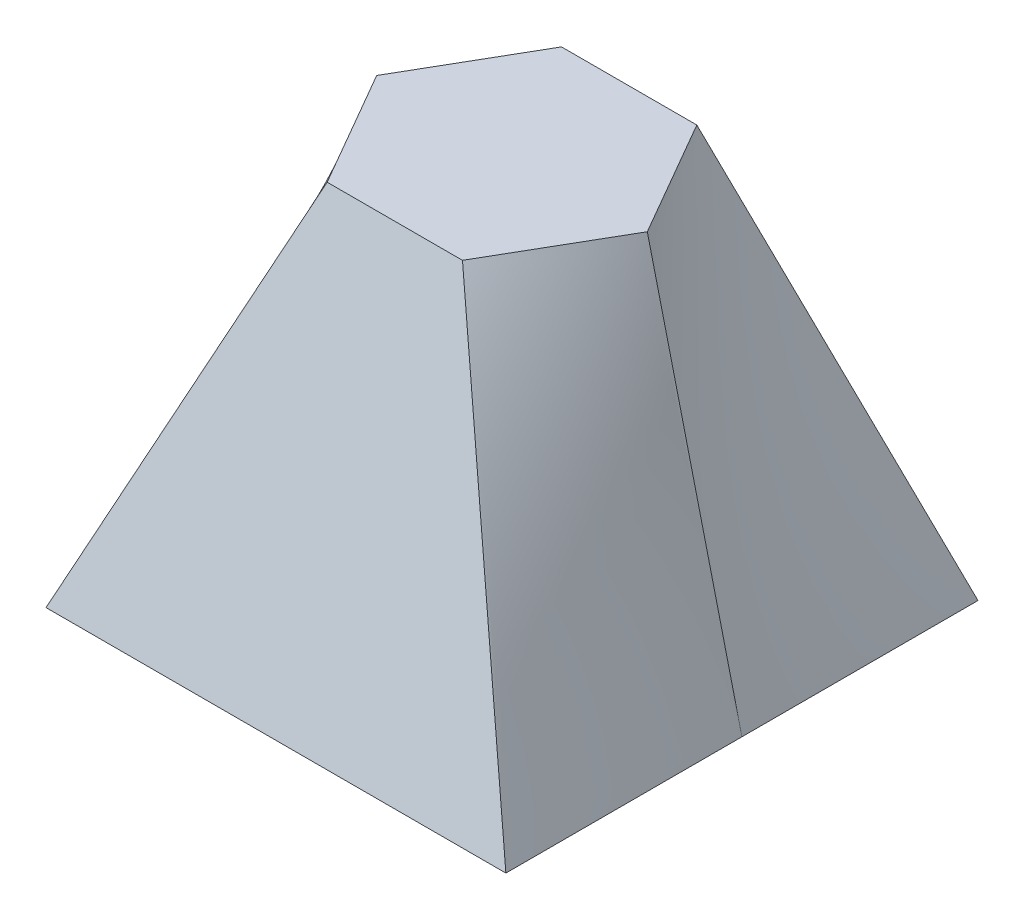
ISO-10303-21;
HEADER;
FILE_DESCRIPTION(('STEP AP214'),'2;1');
FILE_NAME('part.step','',(''),(''),'','','');
FILE_SCHEMA(('AUTOMOTIVE_DESIGN { 1 0 10303 214 1 1 1 1 }'));
ENDSEC;
DATA;
#1=APPLICATION_CONTEXT('core data for automotive mechanical design processes');
#2=APPLICATION_PROTOCOL_DEFINITION('international standard','automotive_design',2000,#1);
#3=PRODUCT_CONTEXT('',#1,'mechanical');
#4=PRODUCT('Part','Part','',(#3));
#5=PRODUCT_RELATED_PRODUCT_CATEGORY('part','',(#4));
#6=PRODUCT_DEFINITION_FORMATION('','',#4);
#7=PRODUCT_DEFINITION_CONTEXT('part definition',#1,'design');
#8=PRODUCT_DEFINITION('design','',#6,#7);
#9=PRODUCT_DEFINITION_SHAPE('','',#8);
#10=(LENGTH_UNIT() NAMED_UNIT(*) SI_UNIT(.MILLI.,.METRE.));
#11=(NAMED_UNIT(*) PLANE_ANGLE_UNIT() SI_UNIT($,.RADIAN.));
#12=(NAMED_UNIT(*) SI_UNIT($,.STERADIAN.) SOLID_ANGLE_UNIT());
#13=UNCERTAINTY_MEASURE_WITH_UNIT(LENGTH_MEASURE(1.E-05),#10,'distance_accuracy_value','');
#14=(GEOMETRIC_REPRESENTATION_CONTEXT(3) GLOBAL_UNCERTAINTY_ASSIGNED_CONTEXT((#13)) GLOBAL_UNIT_ASSIGNED_CONTEXT((#10,
#11,#12)) REPRESENTATION_CONTEXT('',''));
#15=CARTESIAN_POINT('',(0.,0.,0.));
#16=DIRECTION('',(0.,0.,1.));
#17=DIRECTION('',(1.,0.,0.));
#18=AXIS2_PLACEMENT_3D('',#15,#16,#17);
#19=CARTESIAN_POINT('',(0.,76.2,0.));
#20=DIRECTION('',(0.,1.,0.));
#21=DIRECTION('',(0.,0.,1.));
#22=AXIS2_PLACEMENT_3D('',#19,#20,#21);
#23=PLANE('',#22);
#24=DIRECTION('',(0.499999999999995,0.,-0.866025403784442));
#25=VECTOR('',#24,1.);
#26=CARTESIAN_POINT('',(13.2149918826077,76.2,22.8890373622862));
#27=LINE('',#26,#25);
#28=CARTESIAN_POINT('',(13.2149918826077,76.2,22.8890373622862));
#29=VERTEX_POINT('',#28);
#30=CARTESIAN_POINT('',(26.4299837652148,76.2,0.));
#31=VERTEX_POINT('',#30);
#32=EDGE_CURVE('E135',#29,#31,#27,.T.);
#33=ORIENTED_EDGE('',*,*,#32,.T.);
#34=DIRECTION('',(-0.500000000000001,0.,-0.866025403784438));
#35=VECTOR('',#34,1.);
#36=CARTESIAN_POINT('',(26.4299837652148,76.2,0.));
#37=LINE('',#36,#35);
#38=CARTESIAN_POINT('',(13.2149918826074,76.2,-22.8890373622864));
#39=VERTEX_POINT('',#38);
#40=EDGE_CURVE('E137',#31,#39,#37,.T.);
#41=ORIENTED_EDGE('',*,*,#40,.T.);
#42=DIRECTION('',(-1.,0.,0.));
#43=VECTOR('',#42,1.);
#44=CARTESIAN_POINT('',(13.2149918826074,76.2,-22.8890373622864));
#45=LINE('',#44,#43);
#46=CARTESIAN_POINT('',(-13.2149918826075,76.2,-22.8890373622863));
#47=VERTEX_POINT('',#46);
#48=EDGE_CURVE('E268',#39,#47,#45,.T.);
#49=ORIENTED_EDGE('',*,*,#48,.T.);
#50=DIRECTION('',(-0.499999999999995,0.,0.866025403784441));
#51=VECTOR('',#50,1.);
#52=CARTESIAN_POINT('',(-13.2149918826075,76.2,-22.8890373622863));
#53=LINE('',#52,#51);
#54=CARTESIAN_POINT('',(-26.4299837652148,76.2,1.76941794549634E-13));
#55=VERTEX_POINT('',#54);
#56=EDGE_CURVE('E184',#47,#55,#53,.T.);
#57=ORIENTED_EDGE('',*,*,#56,.T.);
#58=DIRECTION('',(0.500000000000007,0.,0.866025403784434));
#59=VECTOR('',#58,1.);
#60=CARTESIAN_POINT('',(-26.4299837652148,76.2,1.84559590204349E-13));
#61=LINE('',#60,#59);
#62=CARTESIAN_POINT('',(-13.2149918826072,76.2,22.8890373622864));
#63=VERTEX_POINT('',#62);
#64=EDGE_CURVE('E58',#55,#63,#61,.T.);
#65=ORIENTED_EDGE('',*,*,#64,.T.);
#66=DIRECTION('',(1.,0.,0.));
#67=VECTOR('',#66,1.);
#68=CARTESIAN_POINT('',(-13.2149918826072,76.2,22.8890373622864));
#69=LINE('',#68,#67);
#70=EDGE_CURVE('E12',#63,#29,#69,.T.);
#71=ORIENTED_EDGE('',*,*,#70,.T.);
#72=EDGE_LOOP('',(#33,#41,#49,#57,#65,#71));
#73=FACE_BOUND('',#72,.T.);
#74=ADVANCED_FACE('F48',(#73),#23,.T.);
#75=CARTESIAN_POINT('',(0.,0.,0.));
#76=DIRECTION('',(0.,-1.,0.));
#77=DIRECTION('',(0.,0.,-1.));
#78=AXIS2_PLACEMENT_3D('',#75,#76,#77);
#79=PLANE('',#78);
#80=DIRECTION('',(0.,0.,-1.));
#81=VECTOR('',#80,1.);
#82=CARTESIAN_POINT('',(44.9137513171536,0.,46.1105522178968));
#83=LINE('',#82,#81);
#84=CARTESIAN_POINT('',(44.9137513171536,0.,46.1105522178968));
#85=VERTEX_POINT('',#84);
#86=CARTESIAN_POINT('',(44.9137513171536,0.,2.77555756156289E-13));
#87=VERTEX_POINT('',#86);
#88=EDGE_CURVE('E129',#85,#87,#83,.T.);
#89=ORIENTED_EDGE('',*,*,#88,.F.);
#90=DIRECTION('',(1.,0.,0.));
#91=VECTOR('',#90,1.);
#92=CARTESIAN_POINT('',(-44.9137513171536,0.,46.1105522178968));
#93=LINE('',#92,#91);
#94=CARTESIAN_POINT('',(-44.9137513171536,0.,46.1105522178968));
#95=VERTEX_POINT('',#94);
#96=EDGE_CURVE('E112',#95,#85,#93,.T.);
#97=ORIENTED_EDGE('',*,*,#96,.F.);
#98=DIRECTION('',(0.,0.,1.));
#99=VECTOR('',#98,1.);
#100=CARTESIAN_POINT('',(-44.9137513171536,0.,46.1105522178968));
#101=LINE('',#100,#99);
#102=CARTESIAN_POINT('',(-44.9137513171536,0.,-46.1105522178968));
#103=VERTEX_POINT('',#102);
#104=EDGE_CURVE('E104',#103,#95,#101,.T.);
#105=ORIENTED_EDGE('',*,*,#104,.F.);
#106=DIRECTION('',(-1.,0.,0.));
#107=VECTOR('',#106,1.);
#108=CARTESIAN_POINT('',(-44.9137513171536,0.,-46.1105522178968));
#109=LINE('',#108,#107);
#110=CARTESIAN_POINT('',(0.,0.,-46.1105522178968));
#111=VERTEX_POINT('',#110);
#112=EDGE_CURVE('E109',#111,#103,#109,.T.);
#113=ORIENTED_EDGE('',*,*,#112,.F.);
#114=CARTESIAN_POINT('',(44.9137513171536,0.,-46.1105522178968));
#115=VERTEX_POINT('',#114);
#116=EDGE_CURVE('E116',#115,#111,#109,.T.);
#117=ORIENTED_EDGE('',*,*,#116,.F.);
#118=EDGE_CURVE('E356',#87,#115,#83,.T.);
#119=ORIENTED_EDGE('',*,*,#118,.F.);
#120=EDGE_LOOP('',(#89,#97,#105,#113,#117,#119));
#121=FACE_BOUND('',#120,.T.);
#122=ADVANCED_FACE('F108',(#121),#79,.T.);
#123=CARTESIAN_POINT('',(4.37544904061669E-13,12.8578323823071,42.1922012247647));
#124=DIRECTION('',(0.,-0.291508690388564,-0.956568180229692));
#125=DIRECTION('',(0.,0.956568180229692,-0.291508690388564));
#126=AXIS2_PLACEMENT_3D('',#123,#124,#125);
#127=PLANE('',#126);
#128=DIRECTION('',(-0.369729511868252,0.888785217684479,-0.270852219631329));
#129=VECTOR('',#128,1.);
#130=CARTESIAN_POINT('',(44.9137513171536,0.,46.1105522178968));
#131=LINE('',#130,#129);
#132=EDGE_CURVE('E365',#85,#29,#131,.T.);
#133=ORIENTED_EDGE('',*,*,#132,.T.);
#134=ORIENTED_EDGE('',*,*,#70,.F.);
#135=DIRECTION('',(0.369729511868257,0.888785217684478,-0.270852219631326));
#136=VECTOR('',#135,1.);
#137=CARTESIAN_POINT('',(-44.9137513171536,0.,46.1105522178968));
#138=LINE('',#137,#136);
#139=EDGE_CURVE('E73',#95,#63,#138,.T.);
#140=ORIENTED_EDGE('',*,*,#139,.F.);
#141=ORIENTED_EDGE('',*,*,#96,.T.);
#142=EDGE_LOOP('',(#133,#134,#140,#141));
#143=FACE_BOUND('',#142,.T.);
#144=ADVANCED_FACE('F210',(#143),#127,.F.);
#145=CARTESIAN_POINT('',(-44.9137513171536,0.,-46.1105522178968));
#146=CARTESIAN_POINT('',(-26.4299837652148,76.2,1.84559590204349E-13));
#147=CARTESIAN_POINT('',(-44.9137513171536,0.,-30.7403681452646));
#148=CARTESIAN_POINT('',(-24.2274851181136,76.2,3.81483956038123));
#149=CARTESIAN_POINT('',(-44.9137513171536,0.,-15.3701840726324));
#150=CARTESIAN_POINT('',(-22.0249864710123,76.2,7.62967912076227));
#151=CARTESIAN_POINT('',(-44.9137513171536,0.,15.3701840726322));
#152=CARTESIAN_POINT('',(-17.6199891768097,76.2,15.2593582415244));
#153=CARTESIAN_POINT('',(-44.9137513171536,0.,30.7403681452645));
#154=CARTESIAN_POINT('',(-15.4174905297085,76.2,19.0741978019054));
#155=CARTESIAN_POINT('',(-44.9137513171536,0.,46.1105522178968));
#156=CARTESIAN_POINT('',(-13.2149918826072,76.2,22.8890373622864));
#157=B_SPLINE_SURFACE_WITH_KNOTS('',3,1,((#145,#146),(#147,#148),(#149,#150),(#151,#152),(#153,
#154),(#155,#156)),.UNSPECIFIED.,.F.,.F.,.F.,(4,2,4),(2,2),(0.,0.5,1.),(0.,1.),.UNSPECIFIED.);
#158=DIRECTION('',(0.203200879589294,0.837702972686438,0.506915310566215));
#159=VECTOR('',#158,1.);
#160=CARTESIAN_POINT('',(-35.6718675411842,38.1,-23.0552761089483));
#161=LINE('',#160,#159);
#162=EDGE_CURVE('E124',#103,#55,#161,.T.);
#163=ORIENTED_EDGE('',*,*,#104,.T.);
#164=ORIENTED_EDGE('',*,*,#139,.T.);
#165=ORIENTED_EDGE('',*,*,#64,.F.);
#166=ORIENTED_EDGE('',*,*,#162,.F.);
#167=EDGE_LOOP('',(#163,#164,#165,#166));
#168=FACE_BOUND('',#167,.T.);
#169=ADVANCED_FACE('F133',(#168),#157,.T.);
#170=CARTESIAN_POINT('',(44.9137513171536,0.,46.1105522178968));
#171=CARTESIAN_POINT('',(13.2149918826077,76.2,22.8890373622862));
#172=CARTESIAN_POINT('',(44.9137513171536,0.,38.425460181581));
#173=CARTESIAN_POINT('',(15.4174905297089,76.2,19.0741978019051));
#174=CARTESIAN_POINT('',(44.9137513171536,0.,30.7403681452651));
#175=CARTESIAN_POINT('',(17.6199891768101,76.2,15.2593582415241));
#176=CARTESIAN_POINT('',(44.9137513171536,0.,15.3701840726329));
#177=CARTESIAN_POINT('',(22.0249864710124,76.2,7.62967912076206));
#178=CARTESIAN_POINT('',(44.9137513171536,0.,7.68509203631665));
#179=CARTESIAN_POINT('',(24.2274851181136,76.2,3.81483956038103));
#180=CARTESIAN_POINT('',(44.9137513171536,0.,2.77555756156289E-13));
#181=CARTESIAN_POINT('',(26.4299837652148,76.2,0.));
#182=B_SPLINE_SURFACE_WITH_KNOTS('',3,1,((#170,#171),(#172,#173),(#174,#175),(#176,#177),(#178,
#179),(#180,#181)),.UNSPECIFIED.,.F.,.F.,.F.,(4,2,4),(2,2),(0.,0.5,1.),(0.,1.),.UNSPECIFIED.);
#183=DIRECTION('',(-0.235733010214862,0.971817857365793,0.));
#184=VECTOR('',#183,1.);
#185=CARTESIAN_POINT('',(35.6718675411842,38.1,1.38777878078145E-13));
#186=LINE('',#185,#184);
#187=EDGE_CURVE('E264',#87,#31,#186,.T.);
#188=ORIENTED_EDGE('',*,*,#88,.T.);
#189=ORIENTED_EDGE('',*,*,#187,.T.);
#190=ORIENTED_EDGE('',*,*,#32,.F.);
#191=ORIENTED_EDGE('',*,*,#132,.F.);
#192=EDGE_LOOP('',(#188,#189,#190,#191));
#193=FACE_BOUND('',#192,.T.);
#194=ADVANCED_FACE('F209',(#193),#182,.T.);
#195=CARTESIAN_POINT('',(44.9137513171536,0.,2.77555756156289E-13));
#196=CARTESIAN_POINT('',(26.4299837652148,76.2,0.));
#197=CARTESIAN_POINT('',(44.9137513171536,0.,-7.6850920363159));
#198=CARTESIAN_POINT('',(24.2274851181136,76.2,-3.81483956038106));
#199=CARTESIAN_POINT('',(44.9137513171536,0.,-15.3701840726321));
#200=CARTESIAN_POINT('',(22.0249864710123,76.2,-7.62967912076212));
#201=CARTESIAN_POINT('',(44.9137513171536,0.,-30.7403681452645));
#202=CARTESIAN_POINT('',(17.6199891768098,76.2,-15.2593582415242));
#203=CARTESIAN_POINT('',(44.9137513171536,0.,-38.4254601815806));
#204=CARTESIAN_POINT('',(15.4174905297086,76.2,-19.0741978019053));
#205=CARTESIAN_POINT('',(44.9137513171536,0.,-46.1105522178968));
#206=CARTESIAN_POINT('',(13.2149918826074,76.2,-22.8890373622864));
#207=B_SPLINE_SURFACE_WITH_KNOTS('',3,1,((#195,#196),(#197,#198),(#199,#200),(#201,#202),(#203,
#204),(#205,#206)),.UNSPECIFIED.,.F.,.F.,.F.,(4,2,4),(2,2),(0.,0.5,1.),(0.,1.),.UNSPECIFIED.);
#208=DIRECTION('',(-0.369729511868255,0.888785217684478,0.270852219631327));
#209=VECTOR('',#208,1.);
#210=CARTESIAN_POINT('',(29.0643715998805,38.1,-34.4997947900916));
#211=LINE('',#210,#209);
#212=EDGE_CURVE('E139',#115,#39,#211,.T.);
#213=ORIENTED_EDGE('',*,*,#118,.T.);
#214=ORIENTED_EDGE('',*,*,#212,.T.);
#215=ORIENTED_EDGE('',*,*,#40,.F.);
#216=ORIENTED_EDGE('',*,*,#187,.F.);
#217=EDGE_LOOP('',(#213,#214,#215,#216));
#218=FACE_BOUND('',#217,.T.);
#219=ADVANCED_FACE('F163',(#218),#207,.T.);
#220=CARTESIAN_POINT('',(-1.49540663413481E-13,12.8578323823068,-42.1922012247645));
#221=DIRECTION('',(0.,-0.291508690388558,0.956568180229693));
#222=DIRECTION('',(0.,-0.956568180229694,-0.291508690388559));
#223=AXIS2_PLACEMENT_3D('',#220,#221,#222);
#224=PLANE('',#223);
#225=DIRECTION('',(-0.163656259195025,0.943671177511178,0.287578402459152));
#226=VECTOR('',#225,1.);
#227=CARTESIAN_POINT('',(0.,0.,-46.1105522178968));
#228=LINE('',#227,#226);
#229=EDGE_CURVE('E127',#111,#47,#228,.T.);
#230=ORIENTED_EDGE('',*,*,#229,.T.);
#231=ORIENTED_EDGE('',*,*,#48,.F.);
#232=ORIENTED_EDGE('',*,*,#212,.F.);
#233=ORIENTED_EDGE('',*,*,#116,.T.);
#234=EDGE_LOOP('',(#230,#231,#232,#233));
#235=FACE_BOUND('',#234,.T.);
#236=ADVANCED_FACE('F154',(#235),#224,.F.);
#237=CARTESIAN_POINT('',(0.,0.,-46.1105522178968));
#238=CARTESIAN_POINT('',(-13.2149918826075,76.2,-22.8890373622863));
#239=CARTESIAN_POINT('',(-7.4856252195256,0.,-46.1105522178968));
#240=CARTESIAN_POINT('',(-15.4174905297087,76.2,-19.0741978019052));
#241=CARTESIAN_POINT('',(-14.9712504390512,0.,-46.1105522178968));
#242=CARTESIAN_POINT('',(-17.61998917681,76.2,-15.2593582415241));
#243=CARTESIAN_POINT('',(-29.9425008781024,0.,-46.1105522178968));
#244=CARTESIAN_POINT('',(-22.0249864710124,76.2,-7.62967912076197));
#245=CARTESIAN_POINT('',(-37.428126097628,0.,-46.1105522178968));
#246=CARTESIAN_POINT('',(-24.2274851181136,76.2,-3.8148395603809));
#247=CARTESIAN_POINT('',(-44.9137513171536,0.,-46.1105522178968));
#248=CARTESIAN_POINT('',(-26.4299837652148,76.2,1.76941794549634E-13));
#249=B_SPLINE_SURFACE_WITH_KNOTS('',3,1,((#237,#238),(#239,#240),(#241,#242),(#243,#244),(#245,
#246),(#247,#248)),.UNSPECIFIED.,.F.,.F.,.F.,(4,2,4),(2,2),(0.,0.5,1.),(0.,1.),.UNSPECIFIED.);
#250=ORIENTED_EDGE('',*,*,#112,.T.);
#251=ORIENTED_EDGE('',*,*,#162,.T.);
#252=ORIENTED_EDGE('',*,*,#56,.F.);
#253=ORIENTED_EDGE('',*,*,#229,.F.);
#254=EDGE_LOOP('',(#250,#251,#252,#253));
#255=FACE_BOUND('',#254,.T.);
#256=ADVANCED_FACE('F123',(#255),#249,.T.);
#257=CLOSED_SHELL('',(#74,#122,#144,#169,#194,#219,#236,#256));
#258=MANIFOLD_SOLID_BREP('B2',#257);
#259=ADVANCED_BREP_SHAPE_REPRESENTATION('',(#18,#258),#14);
#260=SHAPE_DEFINITION_REPRESENTATION(#9,#259);
ENDSEC;
END-ISO-10303-21;
